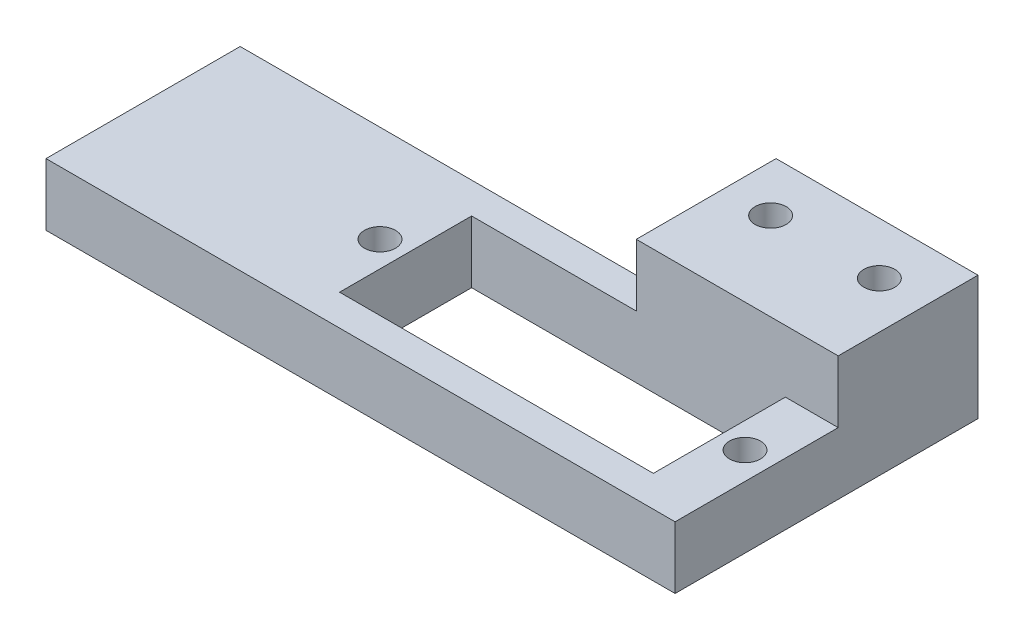
ISO-10303-21;
HEADER;
FILE_DESCRIPTION(('STEP AP214'),'2;1');
FILE_NAME('part.step','',(''),(''),'','','');
FILE_SCHEMA(('AUTOMOTIVE_DESIGN { 1 0 10303 214 1 1 1 1 }'));
ENDSEC;
DATA;
#1=APPLICATION_CONTEXT('core data for automotive mechanical design processes');
#2=APPLICATION_PROTOCOL_DEFINITION('international standard','automotive_design',2000,#1);
#3=PRODUCT_CONTEXT('',#1,'mechanical');
#4=PRODUCT('Part','Part','',(#3));
#5=PRODUCT_RELATED_PRODUCT_CATEGORY('part','',(#4));
#6=PRODUCT_DEFINITION_FORMATION('','',#4);
#7=PRODUCT_DEFINITION_CONTEXT('part definition',#1,'design');
#8=PRODUCT_DEFINITION('design','',#6,#7);
#9=PRODUCT_DEFINITION_SHAPE('','',#8);
#10=(LENGTH_UNIT() NAMED_UNIT(*) SI_UNIT(.MILLI.,.METRE.));
#11=(NAMED_UNIT(*) PLANE_ANGLE_UNIT() SI_UNIT($,.RADIAN.));
#12=(NAMED_UNIT(*) SI_UNIT($,.STERADIAN.) SOLID_ANGLE_UNIT());
#13=UNCERTAINTY_MEASURE_WITH_UNIT(LENGTH_MEASURE(1.E-05),#10,'distance_accuracy_value','');
#14=(GEOMETRIC_REPRESENTATION_CONTEXT(3) GLOBAL_UNCERTAINTY_ASSIGNED_CONTEXT((#13)) GLOBAL_UNIT_ASSIGNED_CONTEXT((#10,
#11,#12)) REPRESENTATION_CONTEXT('',''));
#15=CARTESIAN_POINT('',(0.,0.,0.));
#16=DIRECTION('',(0.,0.,1.));
#17=DIRECTION('',(1.,0.,0.));
#18=AXIS2_PLACEMENT_3D('',#15,#16,#17);
#19=CARTESIAN_POINT('',(0.,4.,0.));
#20=DIRECTION('',(0.,1.,0.));
#21=DIRECTION('',(0.,0.,1.));
#22=AXIS2_PLACEMENT_3D('',#19,#20,#21);
#23=PLANE('',#22);
#24=CARTESIAN_POINT('',(-11.75,4.,6.74999999999992));
#25=DIRECTION('',(0.,1.,0.));
#26=DIRECTION('',(0.,0.,1.));
#27=AXIS2_PLACEMENT_3D('',#24,#25,#26);
#28=CIRCLE('',#27,1.);
#29=CARTESIAN_POINT('',(-11.75,4.,7.74999999999992));
#30=VERTEX_POINT('',#29);
#31=EDGE_CURVE('E165',#30,#30,#28,.T.);
#32=ORIENTED_EDGE('',*,*,#31,.F.);
#33=EDGE_LOOP('',(#32));
#34=FACE_BOUND('',#33,.T.);
#35=CARTESIAN_POINT('',(11.75,4.,6.74999999999992));
#36=DIRECTION('',(0.,1.,0.));
#37=DIRECTION('',(0.,0.,1.));
#38=AXIS2_PLACEMENT_3D('',#35,#36,#37);
#39=CIRCLE('',#38,1.);
#40=CARTESIAN_POINT('',(11.75,4.,7.74999999999992));
#41=VERTEX_POINT('',#40);
#42=EDGE_CURVE('E171',#41,#41,#39,.T.);
#43=ORIENTED_EDGE('',*,*,#42,.F.);
#44=EDGE_LOOP('',(#43));
#45=FACE_BOUND('',#44,.T.);
#46=DIRECTION('',(-1.,0.,0.));
#47=VECTOR('',#46,1.);
#48=CARTESIAN_POINT('',(10.1,4.,2.49999999999992));
#49=LINE('',#48,#47);
#50=CARTESIAN_POINT('',(0.500000000000162,4.,2.49999999999992));
#51=VERTEX_POINT('',#50);
#52=CARTESIAN_POINT('',(-10.1,4.,2.49999999999992));
#53=VERTEX_POINT('',#52);
#54=EDGE_CURVE('E184',#51,#53,#49,.T.);
#55=ORIENTED_EDGE('',*,*,#54,.F.);
#56=DIRECTION('',(0.,0.,-1.));
#57=VECTOR('',#56,1.);
#58=CARTESIAN_POINT('',(0.500000000000162,4.,2.49999999999992));
#59=LINE('',#58,#57);
#60=CARTESIAN_POINT('',(0.500000000000162,4.,0.499999999999924));
#61=VERTEX_POINT('',#60);
#62=EDGE_CURVE('E48',#51,#61,#59,.T.);
#63=ORIENTED_EDGE('',*,*,#62,.T.);
#64=DIRECTION('',(-1.,0.,0.));
#65=VECTOR('',#64,1.);
#66=CARTESIAN_POINT('',(-26.9999999999998,4.,0.499999999999924));
#67=LINE('',#66,#65);
#68=CARTESIAN_POINT('',(-26.9999999999998,4.,0.499999999999924));
#69=VERTEX_POINT('',#68);
#70=EDGE_CURVE('E207',#61,#69,#67,.T.);
#71=ORIENTED_EDGE('',*,*,#70,.T.);
#72=DIRECTION('',(0.,0.,1.));
#73=VECTOR('',#72,1.);
#74=CARTESIAN_POINT('',(-26.9999999999998,4.,12.9999999999999));
#75=LINE('',#74,#73);
#76=CARTESIAN_POINT('',(-26.9999999999998,4.,12.9999999999999));
#77=VERTEX_POINT('',#76);
#78=EDGE_CURVE('E210',#69,#77,#75,.T.);
#79=ORIENTED_EDGE('',*,*,#78,.T.);
#80=DIRECTION('',(1.,0.,0.));
#81=VECTOR('',#80,1.);
#82=CARTESIAN_POINT('',(13.5000000000002,4.,12.9999999999999));
#83=LINE('',#82,#81);
#84=CARTESIAN_POINT('',(13.5000000000002,4.,12.9999999999999));
#85=VERTEX_POINT('',#84);
#86=EDGE_CURVE('E212',#77,#85,#83,.T.);
#87=ORIENTED_EDGE('',*,*,#86,.T.);
#88=DIRECTION('',(0.,0.,-1.));
#89=VECTOR('',#88,1.);
#90=CARTESIAN_POINT('',(13.5000000000002,4.,12.9999999999999));
#91=LINE('',#90,#89);
#92=CARTESIAN_POINT('',(13.5000000000002,4.,2.49999999999992));
#93=VERTEX_POINT('',#92);
#94=EDGE_CURVE('E204',#85,#93,#91,.T.);
#95=ORIENTED_EDGE('',*,*,#94,.T.);
#96=DIRECTION('',(-1.,0.,0.));
#97=VECTOR('',#96,1.);
#98=CARTESIAN_POINT('',(0.500000000000162,4.,2.49999999999992));
#99=LINE('',#98,#97);
#100=CARTESIAN_POINT('',(10.1,4.,2.49999999999992));
#101=VERTEX_POINT('',#100);
#102=EDGE_CURVE('E143',#93,#101,#99,.T.);
#103=ORIENTED_EDGE('',*,*,#102,.T.);
#104=DIRECTION('',(0.,0.,-1.));
#105=VECTOR('',#104,1.);
#106=CARTESIAN_POINT('',(10.1,4.,10.9999999999999));
#107=LINE('',#106,#105);
#108=CARTESIAN_POINT('',(10.1,4.,10.9999999999999));
#109=VERTEX_POINT('',#108);
#110=EDGE_CURVE('E181',#109,#101,#107,.T.);
#111=ORIENTED_EDGE('',*,*,#110,.F.);
#112=DIRECTION('',(1.,0.,0.));
#113=VECTOR('',#112,1.);
#114=CARTESIAN_POINT('',(10.1,4.,10.9999999999999));
#115=LINE('',#114,#113);
#116=CARTESIAN_POINT('',(-10.1,4.,10.9999999999999));
#117=VERTEX_POINT('',#116);
#118=EDGE_CURVE('E178',#117,#109,#115,.T.);
#119=ORIENTED_EDGE('',*,*,#118,.F.);
#120=DIRECTION('',(0.,0.,1.));
#121=VECTOR('',#120,1.);
#122=CARTESIAN_POINT('',(-10.1,4.,10.9999999999999));
#123=LINE('',#122,#121);
#124=EDGE_CURVE('E176',#53,#117,#123,.T.);
#125=ORIENTED_EDGE('',*,*,#124,.F.);
#126=EDGE_LOOP('',(#55,#63,#71,#79,#87,#95,#103,#111,#119,#125));
#127=FACE_BOUND('',#126,.T.);
#128=ADVANCED_FACE('F33',(#34,#45,#127),#23,.T.);
#129=CARTESIAN_POINT('',(0.,0.,0.));
#130=DIRECTION('',(0.,1.,0.));
#131=DIRECTION('',(0.,0.,1.));
#132=AXIS2_PLACEMENT_3D('',#129,#130,#131);
#133=PLANE('',#132);
#134=DIRECTION('',(0.,0.,-1.));
#135=VECTOR('',#134,1.);
#136=CARTESIAN_POINT('',(13.5000000000002,0.,12.9999999999999));
#137=LINE('',#136,#135);
#138=CARTESIAN_POINT('',(13.5000000000002,0.,12.9999999999999));
#139=VERTEX_POINT('',#138);
#140=CARTESIAN_POINT('',(13.5000000000002,0.,-6.50000000000008));
#141=VERTEX_POINT('',#140);
#142=EDGE_CURVE('E203',#139,#141,#137,.T.);
#143=ORIENTED_EDGE('',*,*,#142,.F.);
#144=DIRECTION('',(1.,0.,0.));
#145=VECTOR('',#144,1.);
#146=CARTESIAN_POINT('',(13.5000000000002,0.,12.9999999999999));
#147=LINE('',#146,#145);
#148=CARTESIAN_POINT('',(-26.9999999999998,0.,12.9999999999999));
#149=VERTEX_POINT('',#148);
#150=EDGE_CURVE('E208',#149,#139,#147,.T.);
#151=ORIENTED_EDGE('',*,*,#150,.F.);
#152=DIRECTION('',(0.,0.,1.));
#153=VECTOR('',#152,1.);
#154=CARTESIAN_POINT('',(-26.9999999999998,0.,12.9999999999999));
#155=LINE('',#154,#153);
#156=CARTESIAN_POINT('',(-26.9999999999998,0.,0.499999999999924));
#157=VERTEX_POINT('',#156);
#158=EDGE_CURVE('E222',#157,#149,#155,.T.);
#159=ORIENTED_EDGE('',*,*,#158,.F.);
#160=DIRECTION('',(-1.,0.,0.));
#161=VECTOR('',#160,1.);
#162=CARTESIAN_POINT('',(-26.9999999999998,0.,0.499999999999924));
#163=LINE('',#162,#161);
#164=CARTESIAN_POINT('',(0.500000000000164,0.,0.499999999999924));
#165=VERTEX_POINT('',#164);
#166=EDGE_CURVE('E220',#165,#157,#163,.T.);
#167=ORIENTED_EDGE('',*,*,#166,.F.);
#168=DIRECTION('',(0.,0.,1.));
#169=VECTOR('',#168,1.);
#170=CARTESIAN_POINT('',(0.500000000000164,0.,0.499999999999924));
#171=LINE('',#170,#169);
#172=CARTESIAN_POINT('',(0.500000000000164,0.,-6.50000000000008));
#173=VERTEX_POINT('',#172);
#174=EDGE_CURVE('E218',#173,#165,#171,.T.);
#175=ORIENTED_EDGE('',*,*,#174,.F.);
#176=DIRECTION('',(-1.,0.,0.));
#177=VECTOR('',#176,1.);
#178=CARTESIAN_POINT('',(13.5000000000002,0.,-6.50000000000008));
#179=LINE('',#178,#177);
#180=EDGE_CURVE('E127',#141,#173,#179,.T.);
#181=ORIENTED_EDGE('',*,*,#180,.F.);
#182=EDGE_LOOP('',(#143,#151,#159,#167,#175,#181));
#183=FACE_BOUND('',#182,.T.);
#184=DIRECTION('',(0.,0.,1.));
#185=VECTOR('',#184,1.);
#186=CARTESIAN_POINT('',(-10.1,0.,10.9999999999999));
#187=LINE('',#186,#185);
#188=CARTESIAN_POINT('',(-10.1,0.,2.49999999999992));
#189=VERTEX_POINT('',#188);
#190=CARTESIAN_POINT('',(-10.1,0.,10.9999999999999));
#191=VERTEX_POINT('',#190);
#192=EDGE_CURVE('E56',#189,#191,#187,.T.);
#193=ORIENTED_EDGE('',*,*,#192,.T.);
#194=DIRECTION('',(1.,0.,0.));
#195=VECTOR('',#194,1.);
#196=CARTESIAN_POINT('',(10.1,0.,10.9999999999999));
#197=LINE('',#196,#195);
#198=CARTESIAN_POINT('',(10.1,0.,10.9999999999999));
#199=VERTEX_POINT('',#198);
#200=EDGE_CURVE('E188',#191,#199,#197,.T.);
#201=ORIENTED_EDGE('',*,*,#200,.T.);
#202=DIRECTION('',(0.,0.,-1.));
#203=VECTOR('',#202,1.);
#204=CARTESIAN_POINT('',(10.1,0.,10.9999999999999));
#205=LINE('',#204,#203);
#206=CARTESIAN_POINT('',(10.1,0.,2.49999999999992));
#207=VERTEX_POINT('',#206);
#208=EDGE_CURVE('E191',#199,#207,#205,.T.);
#209=ORIENTED_EDGE('',*,*,#208,.T.);
#210=DIRECTION('',(-1.,0.,0.));
#211=VECTOR('',#210,1.);
#212=CARTESIAN_POINT('',(10.1,0.,2.49999999999992));
#213=LINE('',#212,#211);
#214=EDGE_CURVE('E179',#207,#189,#213,.T.);
#215=ORIENTED_EDGE('',*,*,#214,.T.);
#216=EDGE_LOOP('',(#193,#201,#209,#215));
#217=FACE_BOUND('',#216,.T.);
#218=CARTESIAN_POINT('',(11.75,0.,6.74999999999992));
#219=DIRECTION('',(0.,1.,0.));
#220=DIRECTION('',(0.,0.,1.));
#221=AXIS2_PLACEMENT_3D('',#218,#219,#220);
#222=CIRCLE('',#221,1.);
#223=CARTESIAN_POINT('',(11.75,0.,7.74999999999992));
#224=VERTEX_POINT('',#223);
#225=EDGE_CURVE('E168',#224,#224,#222,.T.);
#226=ORIENTED_EDGE('',*,*,#225,.T.);
#227=EDGE_LOOP('',(#226));
#228=FACE_BOUND('',#227,.T.);
#229=CARTESIAN_POINT('',(-11.75,0.,6.74999999999992));
#230=DIRECTION('',(0.,1.,0.));
#231=DIRECTION('',(0.,0.,1.));
#232=AXIS2_PLACEMENT_3D('',#229,#230,#231);
#233=CIRCLE('',#232,1.);
#234=CARTESIAN_POINT('',(-11.75,0.,7.74999999999992));
#235=VERTEX_POINT('',#234);
#236=EDGE_CURVE('E164',#235,#235,#233,.T.);
#237=ORIENTED_EDGE('',*,*,#236,.T.);
#238=EDGE_LOOP('',(#237));
#239=FACE_BOUND('',#238,.T.);
#240=CARTESIAN_POINT('',(3.5,0.,-3.15000000000008));
#241=DIRECTION('',(0.,1.,0.));
#242=DIRECTION('',(0.,0.,1.));
#243=AXIS2_PLACEMENT_3D('',#240,#241,#242);
#244=CIRCLE('',#243,1.);
#245=CARTESIAN_POINT('',(3.5,0.,-2.15000000000008));
#246=VERTEX_POINT('',#245);
#247=EDGE_CURVE('E161',#246,#246,#244,.T.);
#248=ORIENTED_EDGE('',*,*,#247,.T.);
#249=EDGE_LOOP('',(#248));
#250=FACE_BOUND('',#249,.T.);
#251=CARTESIAN_POINT('',(10.5000000000002,0.,-3.15000000000008));
#252=DIRECTION('',(0.,1.,0.));
#253=DIRECTION('',(0.,0.,1.));
#254=AXIS2_PLACEMENT_3D('',#251,#252,#253);
#255=CIRCLE('',#254,1.);
#256=CARTESIAN_POINT('',(10.5000000000002,0.,-2.15000000000008));
#257=VERTEX_POINT('',#256);
#258=EDGE_CURVE('E157',#257,#257,#255,.T.);
#259=ORIENTED_EDGE('',*,*,#258,.T.);
#260=EDGE_LOOP('',(#259));
#261=FACE_BOUND('',#260,.T.);
#262=ADVANCED_FACE('F242',(#183,#217,#228,#239,#250,#261),#133,.F.);
#263=CARTESIAN_POINT('',(13.5000000000002,4.,12.9999999999999));
#264=DIRECTION('',(-1.,0.,0.));
#265=DIRECTION('',(0.,0.,1.));
#266=AXIS2_PLACEMENT_3D('',#263,#264,#265);
#267=PLANE('',#266);
#268=ORIENTED_EDGE('',*,*,#142,.T.);
#269=DIRECTION('',(0.,-1.,0.));
#270=VECTOR('',#269,1.);
#271=CARTESIAN_POINT('',(13.5000000000002,4.,-6.50000000000008));
#272=LINE('',#271,#270);
#273=CARTESIAN_POINT('',(13.5000000000002,8.,-6.50000000000008));
#274=VERTEX_POINT('',#273);
#275=EDGE_CURVE('E11',#274,#141,#272,.T.);
#276=ORIENTED_EDGE('',*,*,#275,.F.);
#277=DIRECTION('',(0.,0.,1.));
#278=VECTOR('',#277,1.);
#279=CARTESIAN_POINT('',(13.5000000000002,8.,2.49999999999992));
#280=LINE('',#279,#278);
#281=CARTESIAN_POINT('',(13.5000000000002,8.,2.49999999999992));
#282=VERTEX_POINT('',#281);
#283=EDGE_CURVE('E139',#274,#282,#280,.T.);
#284=ORIENTED_EDGE('',*,*,#283,.T.);
#285=DIRECTION('',(0.,-1.,0.));
#286=VECTOR('',#285,1.);
#287=CARTESIAN_POINT('',(13.5000000000002,8.,2.49999999999992));
#288=LINE('',#287,#286);
#289=EDGE_CURVE('E153',#282,#93,#288,.T.);
#290=ORIENTED_EDGE('',*,*,#289,.T.);
#291=ORIENTED_EDGE('',*,*,#94,.F.);
#292=DIRECTION('',(0.,-1.,0.));
#293=VECTOR('',#292,1.);
#294=CARTESIAN_POINT('',(13.5000000000002,4.,12.9999999999999));
#295=LINE('',#294,#293);
#296=EDGE_CURVE('E214',#85,#139,#295,.T.);
#297=ORIENTED_EDGE('',*,*,#296,.T.);
#298=EDGE_LOOP('',(#268,#276,#284,#290,#291,#297));
#299=FACE_BOUND('',#298,.T.);
#300=ADVANCED_FACE('F35',(#299),#267,.F.);
#301=CARTESIAN_POINT('',(13.5000000000002,4.,-6.50000000000008));
#302=DIRECTION('',(0.,0.,1.));
#303=DIRECTION('',(1.,0.,0.));
#304=AXIS2_PLACEMENT_3D('',#301,#302,#303);
#305=PLANE('',#304);
#306=ORIENTED_EDGE('',*,*,#180,.T.);
#307=DIRECTION('',(0.,-1.,0.));
#308=VECTOR('',#307,1.);
#309=CARTESIAN_POINT('',(0.500000000000164,4.,-6.50000000000008));
#310=LINE('',#309,#308);
#311=CARTESIAN_POINT('',(0.500000000000163,8.,-6.50000000000008));
#312=VERTEX_POINT('',#311);
#313=EDGE_CURVE('E41',#312,#173,#310,.T.);
#314=ORIENTED_EDGE('',*,*,#313,.F.);
#315=DIRECTION('',(1.,0.,0.));
#316=VECTOR('',#315,1.);
#317=CARTESIAN_POINT('',(0.500000000000163,8.,-6.50000000000008));
#318=LINE('',#317,#316);
#319=EDGE_CURVE('E126',#312,#274,#318,.T.);
#320=ORIENTED_EDGE('',*,*,#319,.T.);
#321=ORIENTED_EDGE('',*,*,#275,.T.);
#322=EDGE_LOOP('',(#306,#314,#320,#321));
#323=FACE_BOUND('',#322,.T.);
#324=ADVANCED_FACE('F125',(#323),#305,.F.);
#325=CARTESIAN_POINT('',(0.500000000000164,4.,0.499999999999924));
#326=DIRECTION('',(1.,0.,0.));
#327=DIRECTION('',(0.,0.,-1.));
#328=AXIS2_PLACEMENT_3D('',#325,#326,#327);
#329=PLANE('',#328);
#330=ORIENTED_EDGE('',*,*,#174,.T.);
#331=DIRECTION('',(0.,-1.,0.));
#332=VECTOR('',#331,1.);
#333=CARTESIAN_POINT('',(0.500000000000164,4.,0.499999999999924));
#334=LINE('',#333,#332);
#335=EDGE_CURVE('E130',#61,#165,#334,.T.);
#336=ORIENTED_EDGE('',*,*,#335,.F.);
#337=ORIENTED_EDGE('',*,*,#62,.F.);
#338=DIRECTION('',(0.,-1.,0.));
#339=VECTOR('',#338,1.);
#340=CARTESIAN_POINT('',(0.500000000000162,8.,2.49999999999992));
#341=LINE('',#340,#339);
#342=CARTESIAN_POINT('',(0.500000000000162,8.,2.49999999999992));
#343=VERTEX_POINT('',#342);
#344=EDGE_CURVE('E142',#343,#51,#341,.T.);
#345=ORIENTED_EDGE('',*,*,#344,.F.);
#346=DIRECTION('',(0.,0.,-1.));
#347=VECTOR('',#346,1.);
#348=CARTESIAN_POINT('',(0.500000000000162,8.,2.49999999999992));
#349=LINE('',#348,#347);
#350=EDGE_CURVE('E136',#343,#312,#349,.T.);
#351=ORIENTED_EDGE('',*,*,#350,.T.);
#352=ORIENTED_EDGE('',*,*,#313,.T.);
#353=EDGE_LOOP('',(#330,#336,#337,#345,#351,#352));
#354=FACE_BOUND('',#353,.T.);
#355=ADVANCED_FACE('F141',(#354),#329,.F.);
#356=CARTESIAN_POINT('',(-26.9999999999998,4.,0.499999999999924));
#357=DIRECTION('',(0.,0.,1.));
#358=DIRECTION('',(1.,0.,0.));
#359=AXIS2_PLACEMENT_3D('',#356,#357,#358);
#360=PLANE('',#359);
#361=ORIENTED_EDGE('',*,*,#166,.T.);
#362=DIRECTION('',(0.,-1.,0.));
#363=VECTOR('',#362,1.);
#364=CARTESIAN_POINT('',(-26.9999999999998,4.,0.499999999999924));
#365=LINE('',#364,#363);
#366=EDGE_CURVE('E230',#69,#157,#365,.T.);
#367=ORIENTED_EDGE('',*,*,#366,.F.);
#368=ORIENTED_EDGE('',*,*,#70,.F.);
#369=ORIENTED_EDGE('',*,*,#335,.T.);
#370=EDGE_LOOP('',(#361,#367,#368,#369));
#371=FACE_BOUND('',#370,.T.);
#372=ADVANCED_FACE('F237',(#371),#360,.F.);
#373=CARTESIAN_POINT('',(-26.9999999999998,4.,12.9999999999999));
#374=DIRECTION('',(1.,0.,0.));
#375=DIRECTION('',(0.,0.,-1.));
#376=AXIS2_PLACEMENT_3D('',#373,#374,#375);
#377=PLANE('',#376);
#378=CARTESIAN_POINT('',(-26.9999999999998,2.,3.49999999999992));
#379=DIRECTION('',(-1.,0.,0.));
#380=DIRECTION('',(0.,0.,1.));
#381=AXIS2_PLACEMENT_3D('',#378,#379,#380);
#382=CIRCLE('',#381,1.);
#383=CARTESIAN_POINT('',(-26.9999999999998,2.,4.49999999999992));
#384=VERTEX_POINT('',#383);
#385=EDGE_CURVE('E482',#384,#384,#382,.T.);
#386=ORIENTED_EDGE('',*,*,#385,.F.);
#387=EDGE_LOOP('',(#386));
#388=FACE_BOUND('',#387,.T.);
#389=CARTESIAN_POINT('',(-26.9999999999998,2.,9.99999999999993));
#390=DIRECTION('',(-1.,0.,0.));
#391=DIRECTION('',(0.,0.,1.));
#392=AXIS2_PLACEMENT_3D('',#389,#390,#391);
#393=CIRCLE('',#392,1.);
#394=CARTESIAN_POINT('',(-26.9999999999998,2.,10.9999999999999));
#395=VERTEX_POINT('',#394);
#396=EDGE_CURVE('E491',#395,#395,#393,.T.);
#397=ORIENTED_EDGE('',*,*,#396,.F.);
#398=EDGE_LOOP('',(#397));
#399=FACE_BOUND('',#398,.T.);
#400=ORIENTED_EDGE('',*,*,#158,.T.);
#401=DIRECTION('',(0.,-1.,0.));
#402=VECTOR('',#401,1.);
#403=CARTESIAN_POINT('',(-26.9999999999998,4.,12.9999999999999));
#404=LINE('',#403,#402);
#405=EDGE_CURVE('E227',#77,#149,#404,.T.);
#406=ORIENTED_EDGE('',*,*,#405,.F.);
#407=ORIENTED_EDGE('',*,*,#78,.F.);
#408=ORIENTED_EDGE('',*,*,#366,.T.);
#409=EDGE_LOOP('',(#400,#406,#407,#408));
#410=FACE_BOUND('',#409,.T.);
#411=ADVANCED_FACE('F247',(#388,#399,#410),#377,.F.);
#412=CARTESIAN_POINT('',(13.5000000000002,4.,12.9999999999999));
#413=DIRECTION('',(0.,0.,-1.));
#414=DIRECTION('',(-1.,0.,0.));
#415=AXIS2_PLACEMENT_3D('',#412,#413,#414);
#416=PLANE('',#415);
#417=ORIENTED_EDGE('',*,*,#150,.T.);
#418=ORIENTED_EDGE('',*,*,#296,.F.);
#419=ORIENTED_EDGE('',*,*,#86,.F.);
#420=ORIENTED_EDGE('',*,*,#405,.T.);
#421=EDGE_LOOP('',(#417,#418,#419,#420));
#422=FACE_BOUND('',#421,.T.);
#423=ADVANCED_FACE('F251',(#422),#416,.F.);
#424=CARTESIAN_POINT('',(-10.1,4.,10.9999999999999));
#425=DIRECTION('',(1.,0.,0.));
#426=DIRECTION('',(0.,0.,-1.));
#427=AXIS2_PLACEMENT_3D('',#424,#425,#426);
#428=PLANE('',#427);
#429=ORIENTED_EDGE('',*,*,#192,.F.);
#430=DIRECTION('',(0.,-1.,0.));
#431=VECTOR('',#430,1.);
#432=CARTESIAN_POINT('',(-10.1,4.,2.49999999999992));
#433=LINE('',#432,#431);
#434=EDGE_CURVE('E186',#53,#189,#433,.T.);
#435=ORIENTED_EDGE('',*,*,#434,.F.);
#436=ORIENTED_EDGE('',*,*,#124,.T.);
#437=DIRECTION('',(0.,-1.,0.));
#438=VECTOR('',#437,1.);
#439=CARTESIAN_POINT('',(-10.1,4.,10.9999999999999));
#440=LINE('',#439,#438);
#441=EDGE_CURVE('E201',#117,#191,#440,.T.);
#442=ORIENTED_EDGE('',*,*,#441,.T.);
#443=EDGE_LOOP('',(#429,#435,#436,#442));
#444=FACE_BOUND('',#443,.T.);
#445=ADVANCED_FACE('F261',(#444),#428,.T.);
#446=CARTESIAN_POINT('',(10.1,4.,10.9999999999999));
#447=DIRECTION('',(0.,0.,-1.));
#448=DIRECTION('',(-1.,0.,0.));
#449=AXIS2_PLACEMENT_3D('',#446,#447,#448);
#450=PLANE('',#449);
#451=ORIENTED_EDGE('',*,*,#200,.F.);
#452=ORIENTED_EDGE('',*,*,#441,.F.);
#453=ORIENTED_EDGE('',*,*,#118,.T.);
#454=DIRECTION('',(0.,-1.,0.));
#455=VECTOR('',#454,1.);
#456=CARTESIAN_POINT('',(10.1,4.,10.9999999999999));
#457=LINE('',#456,#455);
#458=EDGE_CURVE('E199',#109,#199,#457,.T.);
#459=ORIENTED_EDGE('',*,*,#458,.T.);
#460=EDGE_LOOP('',(#451,#452,#453,#459));
#461=FACE_BOUND('',#460,.T.);
#462=ADVANCED_FACE('F264',(#461),#450,.T.);
#463=CARTESIAN_POINT('',(10.1,4.,10.9999999999999));
#464=DIRECTION('',(-1.,0.,0.));
#465=DIRECTION('',(0.,0.,1.));
#466=AXIS2_PLACEMENT_3D('',#463,#464,#465);
#467=PLANE('',#466);
#468=ORIENTED_EDGE('',*,*,#208,.F.);
#469=ORIENTED_EDGE('',*,*,#458,.F.);
#470=ORIENTED_EDGE('',*,*,#110,.T.);
#471=DIRECTION('',(0.,-1.,0.));
#472=VECTOR('',#471,1.);
#473=CARTESIAN_POINT('',(10.1,4.,2.49999999999992));
#474=LINE('',#473,#472);
#475=EDGE_CURVE('E197',#101,#207,#474,.T.);
#476=ORIENTED_EDGE('',*,*,#475,.T.);
#477=EDGE_LOOP('',(#468,#469,#470,#476));
#478=FACE_BOUND('',#477,.T.);
#479=ADVANCED_FACE('F271',(#478),#467,.T.);
#480=CARTESIAN_POINT('',(10.1,4.,2.49999999999992));
#481=DIRECTION('',(0.,0.,1.));
#482=DIRECTION('',(1.,0.,0.));
#483=AXIS2_PLACEMENT_3D('',#480,#481,#482);
#484=PLANE('',#483);
#485=ORIENTED_EDGE('',*,*,#214,.F.);
#486=ORIENTED_EDGE('',*,*,#475,.F.);
#487=ORIENTED_EDGE('',*,*,#102,.F.);
#488=ORIENTED_EDGE('',*,*,#289,.F.);
#489=DIRECTION('',(-1.,0.,0.));
#490=VECTOR('',#489,1.);
#491=CARTESIAN_POINT('',(0.500000000000162,8.,2.49999999999992));
#492=LINE('',#491,#490);
#493=EDGE_CURVE('E151',#282,#343,#492,.T.);
#494=ORIENTED_EDGE('',*,*,#493,.T.);
#495=ORIENTED_EDGE('',*,*,#344,.T.);
#496=ORIENTED_EDGE('',*,*,#54,.T.);
#497=ORIENTED_EDGE('',*,*,#434,.T.);
#498=EDGE_LOOP('',(#485,#486,#487,#488,#494,#495,#496,#497));
#499=FACE_BOUND('',#498,.T.);
#500=ADVANCED_FACE('F260',(#499),#484,.T.);
#501=CARTESIAN_POINT('',(11.75,4.,6.74999999999992));
#502=DIRECTION('',(0.,-1.,0.));
#503=DIRECTION('',(0.,0.,-1.));
#504=AXIS2_PLACEMENT_3D('',#501,#502,#503);
#505=CYLINDRICAL_SURFACE('',#504,1.);
#506=ORIENTED_EDGE('',*,*,#42,.T.);
#507=EDGE_LOOP('',(#506));
#508=FACE_BOUND('',#507,.T.);
#509=ORIENTED_EDGE('',*,*,#225,.F.);
#510=EDGE_LOOP('',(#509));
#511=FACE_BOUND('',#510,.T.);
#512=ADVANCED_FACE('F340',(#508,#511),#505,.F.);
#513=CARTESIAN_POINT('',(-11.75,4.,6.74999999999992));
#514=DIRECTION('',(0.,-1.,0.));
#515=DIRECTION('',(0.,0.,-1.));
#516=AXIS2_PLACEMENT_3D('',#513,#514,#515);
#517=CYLINDRICAL_SURFACE('',#516,1.);
#518=ORIENTED_EDGE('',*,*,#31,.T.);
#519=EDGE_LOOP('',(#518));
#520=FACE_BOUND('',#519,.T.);
#521=ORIENTED_EDGE('',*,*,#236,.F.);
#522=EDGE_LOOP('',(#521));
#523=FACE_BOUND('',#522,.T.);
#524=ADVANCED_FACE('F347',(#520,#523),#517,.F.);
#525=CARTESIAN_POINT('',(3.5,4.,-3.15000000000008));
#526=DIRECTION('',(0.,-1.,0.));
#527=DIRECTION('',(0.,0.,-1.));
#528=AXIS2_PLACEMENT_3D('',#525,#526,#527);
#529=CYLINDRICAL_SURFACE('',#528,1.);
#530=ORIENTED_EDGE('',*,*,#247,.F.);
#531=EDGE_LOOP('',(#530));
#532=FACE_BOUND('',#531,.T.);
#533=CARTESIAN_POINT('',(3.5,8.,-3.15000000000008));
#534=DIRECTION('',(0.,1.,0.));
#535=DIRECTION('',(0.,0.,1.));
#536=AXIS2_PLACEMENT_3D('',#533,#534,#535);
#537=CIRCLE('',#536,1.);
#538=CARTESIAN_POINT('',(3.5,8.,-2.15000000000008));
#539=VERTEX_POINT('',#538);
#540=EDGE_CURVE('E147',#539,#539,#537,.T.);
#541=ORIENTED_EDGE('',*,*,#540,.T.);
#542=EDGE_LOOP('',(#541));
#543=FACE_BOUND('',#542,.T.);
#544=ADVANCED_FACE('F355',(#532,#543),#529,.F.);
#545=CARTESIAN_POINT('',(10.5000000000002,4.,-3.15000000000008));
#546=DIRECTION('',(0.,-1.,0.));
#547=DIRECTION('',(0.,0.,-1.));
#548=AXIS2_PLACEMENT_3D('',#545,#546,#547);
#549=CYLINDRICAL_SURFACE('',#548,1.);
#550=ORIENTED_EDGE('',*,*,#258,.F.);
#551=EDGE_LOOP('',(#550));
#552=FACE_BOUND('',#551,.T.);
#553=CARTESIAN_POINT('',(10.5000000000002,8.,-3.15000000000008));
#554=DIRECTION('',(0.,1.,0.));
#555=DIRECTION('',(0.,0.,1.));
#556=AXIS2_PLACEMENT_3D('',#553,#554,#555);
#557=CIRCLE('',#556,1.);
#558=CARTESIAN_POINT('',(10.5000000000002,8.,-2.15000000000008));
#559=VERTEX_POINT('',#558);
#560=EDGE_CURVE('E154',#559,#559,#557,.T.);
#561=ORIENTED_EDGE('',*,*,#560,.T.);
#562=EDGE_LOOP('',(#561));
#563=FACE_BOUND('',#562,.T.);
#564=ADVANCED_FACE('F362',(#552,#563),#549,.F.);
#565=CARTESIAN_POINT('',(0.,8.,0.));
#566=DIRECTION('',(0.,-1.,0.));
#567=DIRECTION('',(0.,0.,-1.));
#568=AXIS2_PLACEMENT_3D('',#565,#566,#567);
#569=PLANE('',#568);
#570=ORIENTED_EDGE('',*,*,#560,.F.);
#571=EDGE_LOOP('',(#570));
#572=FACE_BOUND('',#571,.T.);
#573=ORIENTED_EDGE('',*,*,#540,.F.);
#574=EDGE_LOOP('',(#573));
#575=FACE_BOUND('',#574,.T.);
#576=ORIENTED_EDGE('',*,*,#350,.F.);
#577=ORIENTED_EDGE('',*,*,#493,.F.);
#578=ORIENTED_EDGE('',*,*,#283,.F.);
#579=ORIENTED_EDGE('',*,*,#319,.F.);
#580=EDGE_LOOP('',(#576,#577,#578,#579));
#581=FACE_BOUND('',#580,.T.);
#582=ADVANCED_FACE('F134',(#572,#575,#581),#569,.F.);
#583=CARTESIAN_POINT('',(-16.9999999999998,2.,9.99999999999993));
#584=DIRECTION('',(-1.,0.,0.));
#585=DIRECTION('',(0.,0.,1.));
#586=AXIS2_PLACEMENT_3D('',#583,#584,#585);
#587=CYLINDRICAL_SURFACE('',#586,1.);
#588=CARTESIAN_POINT('',(-16.9999999999998,2.,9.99999999999993));
#589=DIRECTION('',(-1.,0.,0.));
#590=DIRECTION('',(0.,0.,1.));
#591=AXIS2_PLACEMENT_3D('',#588,#589,#590);
#592=CIRCLE('',#591,1.);
#593=CARTESIAN_POINT('',(-16.9999999999998,2.,10.9999999999999));
#594=VERTEX_POINT('',#593);
#595=EDGE_CURVE('E486',#594,#594,#592,.T.);
#596=ORIENTED_EDGE('',*,*,#595,.F.);
#597=EDGE_LOOP('',(#596));
#598=FACE_BOUND('',#597,.T.);
#599=ORIENTED_EDGE('',*,*,#396,.T.);
#600=EDGE_LOOP('',(#599));
#601=FACE_BOUND('',#600,.T.);
#602=ADVANCED_FACE('F376',(#598,#601),#587,.F.);
#603=CARTESIAN_POINT('',(-16.9999999999998,2.,9.99999999999993));
#604=DIRECTION('',(-1.,0.,0.));
#605=DIRECTION('',(0.,0.,1.));
#606=AXIS2_PLACEMENT_3D('',#603,#604,#605);
#607=PLANE('',#606);
#608=ORIENTED_EDGE('',*,*,#595,.T.);
#609=EDGE_LOOP('',(#608));
#610=FACE_BOUND('',#609,.T.);
#611=ADVANCED_FACE('F383',(#610),#607,.T.);
#612=CARTESIAN_POINT('',(-16.9999999999998,2.,3.49999999999992));
#613=DIRECTION('',(-1.,0.,0.));
#614=DIRECTION('',(0.,0.,1.));
#615=AXIS2_PLACEMENT_3D('',#612,#613,#614);
#616=CYLINDRICAL_SURFACE('',#615,1.);
#617=CARTESIAN_POINT('',(-16.9999999999998,2.,3.49999999999992));
#618=DIRECTION('',(-1.,0.,0.));
#619=DIRECTION('',(0.,0.,1.));
#620=AXIS2_PLACEMENT_3D('',#617,#618,#619);
#621=CIRCLE('',#620,1.);
#622=CARTESIAN_POINT('',(-16.9999999999998,2.,4.49999999999992));
#623=VERTEX_POINT('',#622);
#624=EDGE_CURVE('E481',#623,#623,#621,.T.);
#625=ORIENTED_EDGE('',*,*,#624,.F.);
#626=EDGE_LOOP('',(#625));
#627=FACE_BOUND('',#626,.T.);
#628=ORIENTED_EDGE('',*,*,#385,.T.);
#629=EDGE_LOOP('',(#628));
#630=FACE_BOUND('',#629,.T.);
#631=ADVANCED_FACE('F391',(#627,#630),#616,.F.);
#632=CARTESIAN_POINT('',(-16.9999999999998,2.,3.49999999999992));
#633=DIRECTION('',(-1.,0.,0.));
#634=DIRECTION('',(0.,0.,1.));
#635=AXIS2_PLACEMENT_3D('',#632,#633,#634);
#636=PLANE('',#635);
#637=ORIENTED_EDGE('',*,*,#624,.T.);
#638=EDGE_LOOP('',(#637));
#639=FACE_BOUND('',#638,.T.);
#640=ADVANCED_FACE('F399',(#639),#636,.T.);
#641=CLOSED_SHELL('',(#128,#262,#300,#324,#355,#372,#411,#423,#445,#462,#479,#500,#512,#524,
#544,#564,#582,#602,#611,#631,#640));
#642=MANIFOLD_SOLID_BREP('B2',#641);
#643=ADVANCED_BREP_SHAPE_REPRESENTATION('',(#18,#642),#14);
#644=SHAPE_DEFINITION_REPRESENTATION(#9,#643);
ENDSEC;
END-ISO-10303-21;
